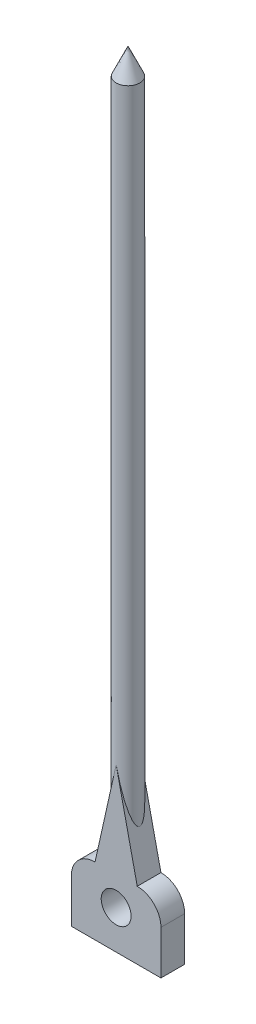
ISO-10303-21;
HEADER;
FILE_DESCRIPTION(('STEP AP214'),'2;1');
FILE_NAME('part.step','',(''),(''),'','','');
FILE_SCHEMA(('AUTOMOTIVE_DESIGN { 1 0 10303 214 1 1 1 1 }'));
ENDSEC;
DATA;
#1=APPLICATION_CONTEXT('core data for automotive mechanical design processes');
#2=APPLICATION_PROTOCOL_DEFINITION('international standard','automotive_design',2000,#1);
#3=PRODUCT_CONTEXT('',#1,'mechanical');
#4=PRODUCT('Part','Part','',(#3));
#5=PRODUCT_RELATED_PRODUCT_CATEGORY('part','',(#4));
#6=PRODUCT_DEFINITION_FORMATION('','',#4);
#7=PRODUCT_DEFINITION_CONTEXT('part definition',#1,'design');
#8=PRODUCT_DEFINITION('design','',#6,#7);
#9=PRODUCT_DEFINITION_SHAPE('','',#8);
#10=(LENGTH_UNIT() NAMED_UNIT(*) SI_UNIT(.MILLI.,.METRE.));
#11=(NAMED_UNIT(*) PLANE_ANGLE_UNIT() SI_UNIT($,.RADIAN.));
#12=(NAMED_UNIT(*) SI_UNIT($,.STERADIAN.) SOLID_ANGLE_UNIT());
#13=UNCERTAINTY_MEASURE_WITH_UNIT(LENGTH_MEASURE(1.E-05),#10,'distance_accuracy_value','');
#14=(GEOMETRIC_REPRESENTATION_CONTEXT(3) GLOBAL_UNCERTAINTY_ASSIGNED_CONTEXT((#13)) GLOBAL_UNIT_ASSIGNED_CONTEXT((#10,
#11,#12)) REPRESENTATION_CONTEXT('',''));
#15=CARTESIAN_POINT('',(0.,0.,0.));
#16=DIRECTION('',(0.,0.,1.));
#17=DIRECTION('',(1.,0.,0.));
#18=AXIS2_PLACEMENT_3D('',#15,#16,#17);
#19=CARTESIAN_POINT('',(9.44828279860412,0.,5.));
#20=DIRECTION('',(-1.,0.,0.));
#21=DIRECTION('',(0.,0.,1.));
#22=AXIS2_PLACEMENT_3D('',#19,#20,#21);
#23=PLANE('',#22);
#24=DIRECTION('',(0.,1.,0.));
#25=VECTOR('',#24,1.);
#26=CARTESIAN_POINT('',(9.44828279860412,0.,0.));
#27=LINE('',#26,#25);
#28=CARTESIAN_POINT('',(9.44828279860412,-8.14999999999999,0.));
#29=VERTEX_POINT('',#28);
#30=CARTESIAN_POINT('',(9.44828279860412,1.10000000000002,0.));
#31=VERTEX_POINT('',#30);
#32=EDGE_CURVE('E135',#29,#31,#27,.T.);
#33=ORIENTED_EDGE('',*,*,#32,.T.);
#34=DIRECTION('',(0.,0.,-1.));
#35=VECTOR('',#34,1.);
#36=CARTESIAN_POINT('',(9.44828279860412,1.10000000000002,5.));
#37=LINE('',#36,#35);
#38=CARTESIAN_POINT('',(9.44828279860412,1.10000000000002,5.));
#39=VERTEX_POINT('',#38);
#40=EDGE_CURVE('E152',#39,#31,#37,.T.);
#41=ORIENTED_EDGE('',*,*,#40,.F.);
#42=DIRECTION('',(0.,1.,0.));
#43=VECTOR('',#42,1.);
#44=CARTESIAN_POINT('',(9.44828279860412,0.,5.));
#45=LINE('',#44,#43);
#46=CARTESIAN_POINT('',(9.44828279860412,-8.14999999999999,5.));
#47=VERTEX_POINT('',#46);
#48=EDGE_CURVE('E176',#47,#39,#45,.T.);
#49=ORIENTED_EDGE('',*,*,#48,.F.);
#50=DIRECTION('',(0.,0.,-1.));
#51=VECTOR('',#50,1.);
#52=CARTESIAN_POINT('',(9.44828279860412,-8.14999999999999,5.));
#53=LINE('',#52,#51);
#54=EDGE_CURVE('E128',#47,#29,#53,.T.);
#55=ORIENTED_EDGE('',*,*,#54,.T.);
#56=EDGE_LOOP('',(#33,#41,#49,#55));
#57=FACE_BOUND('',#56,.T.);
#58=ADVANCED_FACE('F35',(#57),#23,.F.);
#59=CARTESIAN_POINT('',(4.44828279860412,1.10000000000002,5.));
#60=DIRECTION('',(0.,0.,-1.));
#61=DIRECTION('',(-1.,0.,0.));
#62=AXIS2_PLACEMENT_3D('',#59,#60,#61);
#63=CYLINDRICAL_SURFACE('',#62,5.);
#64=CARTESIAN_POINT('',(4.44828279860412,1.10000000000002,0.));
#65=DIRECTION('',(0.,0.,1.));
#66=DIRECTION('',(1.,0.,0.));
#67=AXIS2_PLACEMENT_3D('',#64,#65,#66);
#68=CIRCLE('',#67,5.);
#69=CARTESIAN_POINT('',(4.44828279860412,6.10000000000002,0.));
#70=VERTEX_POINT('',#69);
#71=EDGE_CURVE('E139',#31,#70,#68,.T.);
#72=ORIENTED_EDGE('',*,*,#71,.T.);
#73=DIRECTION('',(0.,0.,-1.));
#74=VECTOR('',#73,1.);
#75=CARTESIAN_POINT('',(4.44828279860412,6.10000000000002,5.));
#76=LINE('',#75,#74);
#77=CARTESIAN_POINT('',(4.44828279860412,6.10000000000002,5.));
#78=VERTEX_POINT('',#77);
#79=EDGE_CURVE('E149',#78,#70,#76,.T.);
#80=ORIENTED_EDGE('',*,*,#79,.F.);
#81=CARTESIAN_POINT('',(4.44828279860412,1.10000000000002,5.));
#82=DIRECTION('',(0.,0.,1.));
#83=DIRECTION('',(1.,0.,0.));
#84=AXIS2_PLACEMENT_3D('',#81,#82,#83);
#85=CIRCLE('',#84,5.);
#86=EDGE_CURVE('E95',#39,#78,#85,.T.);
#87=ORIENTED_EDGE('',*,*,#86,.F.);
#88=ORIENTED_EDGE('',*,*,#40,.T.);
#89=EDGE_LOOP('',(#72,#80,#87,#88));
#90=FACE_BOUND('',#89,.T.);
#91=ADVANCED_FACE('F181',(#90),#63,.T.);
#92=CARTESIAN_POINT('',(-4.44828284917672,1.10000000000002,5.));
#93=DIRECTION('',(0.,0.,-1.));
#94=DIRECTION('',(-1.,0.,0.));
#95=AXIS2_PLACEMENT_3D('',#92,#93,#94);
#96=CYLINDRICAL_SURFACE('',#95,5.);
#97=CARTESIAN_POINT('',(-4.44828284917672,1.10000000000002,0.));
#98=DIRECTION('',(0.,0.,1.));
#99=DIRECTION('',(1.,0.,0.));
#100=AXIS2_PLACEMENT_3D('',#97,#98,#99);
#101=CIRCLE('',#100,5.);
#102=CARTESIAN_POINT('',(-4.44828284917865,6.10000000000002,0.));
#103=VERTEX_POINT('',#102);
#104=CARTESIAN_POINT('',(-9.44828284917672,1.10000000000002,0.));
#105=VERTEX_POINT('',#104);
#106=EDGE_CURVE('E120',#103,#105,#101,.T.);
#107=ORIENTED_EDGE('',*,*,#106,.T.);
#108=DIRECTION('',(0.,0.,-1.));
#109=VECTOR('',#108,1.);
#110=CARTESIAN_POINT('',(-9.44828284917672,1.10000000000002,5.));
#111=LINE('',#110,#109);
#112=CARTESIAN_POINT('',(-9.44828284917672,1.10000000000002,5.));
#113=VERTEX_POINT('',#112);
#114=EDGE_CURVE('E118',#113,#105,#111,.T.);
#115=ORIENTED_EDGE('',*,*,#114,.F.);
#116=CARTESIAN_POINT('',(-4.44828284917672,1.10000000000002,5.));
#117=DIRECTION('',(0.,0.,1.));
#118=DIRECTION('',(1.,0.,0.));
#119=AXIS2_PLACEMENT_3D('',#116,#117,#118);
#120=CIRCLE('',#119,5.);
#121=CARTESIAN_POINT('',(-4.44828284917865,6.10000000000002,5.));
#122=VERTEX_POINT('',#121);
#123=EDGE_CURVE('E104',#122,#113,#120,.T.);
#124=ORIENTED_EDGE('',*,*,#123,.F.);
#125=DIRECTION('',(0.,0.,-1.));
#126=VECTOR('',#125,1.);
#127=CARTESIAN_POINT('',(-4.44828284917865,6.10000000000002,5.));
#128=LINE('',#127,#126);
#129=EDGE_CURVE('E123',#122,#103,#128,.T.);
#130=ORIENTED_EDGE('',*,*,#129,.T.);
#131=EDGE_LOOP('',(#107,#115,#124,#130));
#132=FACE_BOUND('',#131,.T.);
#133=ADVANCED_FACE('F119',(#132),#96,.T.);
#134=CARTESIAN_POINT('',(-9.44828284917673,1.45690293921208E-13,5.));
#135=DIRECTION('',(1.,0.,0.));
#136=DIRECTION('',(0.,1.,0.));
#137=AXIS2_PLACEMENT_3D('',#134,#135,#136);
#138=PLANE('',#137);
#139=DIRECTION('',(0.,-1.,0.));
#140=VECTOR('',#139,1.);
#141=CARTESIAN_POINT('',(-9.44828284917673,1.45690293921208E-13,0.));
#142=LINE('',#141,#140);
#143=CARTESIAN_POINT('',(-9.44828284917686,-8.14999999999999,0.));
#144=VERTEX_POINT('',#143);
#145=EDGE_CURVE('E142',#105,#144,#142,.T.);
#146=ORIENTED_EDGE('',*,*,#145,.T.);
#147=DIRECTION('',(0.,0.,-1.));
#148=VECTOR('',#147,1.);
#149=CARTESIAN_POINT('',(-9.44828284917686,-8.14999999999999,5.));
#150=LINE('',#149,#148);
#151=CARTESIAN_POINT('',(-9.44828284917686,-8.14999999999999,5.));
#152=VERTEX_POINT('',#151);
#153=EDGE_CURVE('E124',#152,#144,#150,.T.);
#154=ORIENTED_EDGE('',*,*,#153,.F.);
#155=DIRECTION('',(0.,-1.,0.));
#156=VECTOR('',#155,1.);
#157=CARTESIAN_POINT('',(-9.44828284917673,1.45690293921208E-13,5.));
#158=LINE('',#157,#156);
#159=EDGE_CURVE('E109',#113,#152,#158,.T.);
#160=ORIENTED_EDGE('',*,*,#159,.F.);
#161=ORIENTED_EDGE('',*,*,#114,.T.);
#162=EDGE_LOOP('',(#146,#154,#160,#161));
#163=FACE_BOUND('',#162,.T.);
#164=ADVANCED_FACE('F126',(#163),#138,.F.);
#165=CARTESIAN_POINT('',(0.,0.,5.));
#166=DIRECTION('',(0.,0.,-1.));
#167=DIRECTION('',(-1.,0.,0.));
#168=AXIS2_PLACEMENT_3D('',#165,#166,#167);
#169=CYLINDRICAL_SURFACE('',#168,3.15);
#170=CARTESIAN_POINT('',(0.,0.,5.));
#171=DIRECTION('',(0.,0.,1.));
#172=DIRECTION('',(1.,0.,0.));
#173=AXIS2_PLACEMENT_3D('',#170,#171,#172);
#174=CIRCLE('',#173,3.15);
#175=CARTESIAN_POINT('',(3.15,0.,5.));
#176=VERTEX_POINT('',#175);
#177=EDGE_CURVE('E145',#176,#176,#174,.T.);
#178=ORIENTED_EDGE('',*,*,#177,.T.);
#179=EDGE_LOOP('',(#178));
#180=FACE_BOUND('',#179,.T.);
#181=CARTESIAN_POINT('',(0.,0.,0.));
#182=DIRECTION('',(0.,0.,1.));
#183=DIRECTION('',(1.,0.,0.));
#184=AXIS2_PLACEMENT_3D('',#181,#182,#183);
#185=CIRCLE('',#184,3.15);
#186=CARTESIAN_POINT('',(3.15,0.,0.));
#187=VERTEX_POINT('',#186);
#188=EDGE_CURVE('E132',#187,#187,#185,.T.);
#189=ORIENTED_EDGE('',*,*,#188,.F.);
#190=EDGE_LOOP('',(#189));
#191=FACE_BOUND('',#190,.T.);
#192=ADVANCED_FACE('F37',(#180,#191),#169,.F.);
#193=CARTESIAN_POINT('',(0.,-8.14999999999999,5.));
#194=DIRECTION('',(0.,1.,0.));
#195=DIRECTION('',(0.,0.,1.));
#196=AXIS2_PLACEMENT_3D('',#193,#194,#195);
#197=PLANE('',#196);
#198=DIRECTION('',(1.,0.,0.));
#199=VECTOR('',#198,1.);
#200=CARTESIAN_POINT('',(0.,-8.14999999999999,0.));
#201=LINE('',#200,#199);
#202=EDGE_CURVE('E86',#144,#29,#201,.T.);
#203=ORIENTED_EDGE('',*,*,#202,.T.);
#204=ORIENTED_EDGE('',*,*,#54,.F.);
#205=DIRECTION('',(1.,0.,0.));
#206=VECTOR('',#205,1.);
#207=CARTESIAN_POINT('',(0.,-8.14999999999999,5.));
#208=LINE('',#207,#206);
#209=EDGE_CURVE('E59',#152,#47,#208,.T.);
#210=ORIENTED_EDGE('',*,*,#209,.F.);
#211=ORIENTED_EDGE('',*,*,#153,.T.);
#212=EDGE_LOOP('',(#203,#204,#210,#211));
#213=FACE_BOUND('',#212,.T.);
#214=ADVANCED_FACE('F189',(#213),#197,.F.);
#215=CARTESIAN_POINT('',(0.,0.,5.));
#216=DIRECTION('',(0.,0.,1.));
#217=DIRECTION('',(1.,0.,0.));
#218=AXIS2_PLACEMENT_3D('',#215,#216,#217);
#219=PLANE('',#218);
#220=DIRECTION('',(0.217351910645245,0.976093308520687,0.));
#221=VECTOR('',#220,1.);
#222=CARTESIAN_POINT('',(0.,26.0765399374634,5.));
#223=LINE('',#222,#221);
#224=CARTESIAN_POINT('',(0.,26.0765399374634,5.));
#225=VERTEX_POINT('',#224);
#226=EDGE_CURVE('E113',#122,#225,#223,.T.);
#227=ORIENTED_EDGE('',*,*,#226,.F.);
#228=ORIENTED_EDGE('',*,*,#123,.T.);
#229=ORIENTED_EDGE('',*,*,#159,.T.);
#230=ORIENTED_EDGE('',*,*,#209,.T.);
#231=ORIENTED_EDGE('',*,*,#48,.T.);
#232=ORIENTED_EDGE('',*,*,#86,.T.);
#233=DIRECTION('',(0.217351908290908,-0.97609330904494,0.));
#234=VECTOR('',#233,1.);
#235=CARTESIAN_POINT('',(0.,26.0765399374634,5.));
#236=LINE('',#235,#234);
#237=EDGE_CURVE('E163',#225,#78,#236,.T.);
#238=ORIENTED_EDGE('',*,*,#237,.F.);
#239=EDGE_LOOP('',(#227,#228,#229,#230,#231,#232,#238));
#240=FACE_BOUND('',#239,.T.);
#241=ORIENTED_EDGE('',*,*,#177,.F.);
#242=EDGE_LOOP('',(#241));
#243=FACE_BOUND('',#242,.T.);
#244=ADVANCED_FACE('F106',(#240,#243),#219,.T.);
#245=CARTESIAN_POINT('',(0.,0.,0.));
#246=DIRECTION('',(0.,0.,1.));
#247=DIRECTION('',(1.,0.,0.));
#248=AXIS2_PLACEMENT_3D('',#245,#246,#247);
#249=PLANE('',#248);
#250=ORIENTED_EDGE('',*,*,#106,.F.);
#251=DIRECTION('',(0.217351910645245,0.976093308520687,0.));
#252=VECTOR('',#251,1.);
#253=CARTESIAN_POINT('',(0.,26.0765399374634,0.));
#254=LINE('',#253,#252);
#255=CARTESIAN_POINT('',(0.,26.0765399374634,0.));
#256=VERTEX_POINT('',#255);
#257=EDGE_CURVE('E50',#103,#256,#254,.T.);
#258=ORIENTED_EDGE('',*,*,#257,.T.);
#259=DIRECTION('',(0.217351908290908,-0.97609330904494,0.));
#260=VECTOR('',#259,1.);
#261=CARTESIAN_POINT('',(0.,26.0765399374634,0.));
#262=LINE('',#261,#260);
#263=EDGE_CURVE('E164',#256,#70,#262,.T.);
#264=ORIENTED_EDGE('',*,*,#263,.T.);
#265=ORIENTED_EDGE('',*,*,#71,.F.);
#266=ORIENTED_EDGE('',*,*,#32,.F.);
#267=ORIENTED_EDGE('',*,*,#202,.F.);
#268=ORIENTED_EDGE('',*,*,#145,.F.);
#269=EDGE_LOOP('',(#250,#258,#264,#265,#266,#267,#268));
#270=FACE_BOUND('',#269,.T.);
#271=ORIENTED_EDGE('',*,*,#188,.T.);
#272=EDGE_LOOP('',(#271));
#273=FACE_BOUND('',#272,.T.);
#274=ADVANCED_FACE('F182',(#270,#273),#249,.F.);
#275=CARTESIAN_POINT('',(0.,26.0765399374634,26.8680366790973));
#276=DIRECTION('',(-0.976093308520687,0.217351910645245,0.));
#277=DIRECTION('',(-0.217351910645245,-0.976093308520687,0.));
#278=AXIS2_PLACEMENT_3D('',#275,#276,#277);
#279=PLANE('',#278);
#280=CARTESIAN_POINT('',(0.,26.0765399374634,2.5));
#281=DIRECTION('',(-0.976093308520687,0.217351910645245,0.));
#282=DIRECTION('',(-0.217351910645245,-0.976093308520687,0.));
#283=AXIS2_PLACEMENT_3D('',#280,#281,#282);
#284=ELLIPSE('',#283,11.5020843045655,2.5);
#285=EDGE_CURVE('E11',#256,#225,#284,.T.);
#286=ORIENTED_EDGE('',*,*,#285,.F.);
#287=ORIENTED_EDGE('',*,*,#257,.F.);
#288=ORIENTED_EDGE('',*,*,#129,.F.);
#289=ORIENTED_EDGE('',*,*,#226,.T.);
#290=EDGE_LOOP('',(#286,#287,#288,#289));
#291=FACE_BOUND('',#290,.T.);
#292=ADVANCED_FACE('F167',(#291),#279,.T.);
#293=CARTESIAN_POINT('',(0.,26.0765399374634,26.8680366790973));
#294=DIRECTION('',(0.97609330904494,0.217351908290908,0.));
#295=DIRECTION('',(-0.217351908290908,0.97609330904494,0.));
#296=AXIS2_PLACEMENT_3D('',#293,#294,#295);
#297=PLANE('',#296);
#298=CARTESIAN_POINT('',(0.,26.0765399374634,2.5));
#299=DIRECTION('',(0.97609330904494,0.217351908290908,0.));
#300=DIRECTION('',(0.217351908290908,-0.97609330904494,0.));
#301=AXIS2_PLACEMENT_3D('',#298,#299,#300);
#302=ELLIPSE('',#301,11.5020844291551,2.5);
#303=EDGE_CURVE('E43',#225,#256,#302,.T.);
#304=ORIENTED_EDGE('',*,*,#303,.F.);
#305=ORIENTED_EDGE('',*,*,#237,.T.);
#306=ORIENTED_EDGE('',*,*,#79,.T.);
#307=ORIENTED_EDGE('',*,*,#263,.F.);
#308=EDGE_LOOP('',(#304,#305,#306,#307));
#309=FACE_BOUND('',#308,.T.);
#310=ADVANCED_FACE('F162',(#309),#297,.T.);
#311=CARTESIAN_POINT('',(0.,156.1,2.5));
#312=DIRECTION('',(0.,-1.,0.));
#313=DIRECTION('',(0.,0.,-1.));
#314=AXIS2_PLACEMENT_3D('',#311,#312,#313);
#315=CONICAL_SURFACE('',#314,0.,0.426823200602846);
#316=CARTESIAN_POINT('',(0.,150.602856099474,2.5));
#317=DIRECTION('',(0.,-1.,0.));
#318=DIRECTION('',(0.,0.,-1.));
#319=AXIS2_PLACEMENT_3D('',#316,#317,#318);
#320=CIRCLE('',#319,2.50000000000001);
#321=CARTESIAN_POINT('',(0.,150.602856099474,0.));
#322=VERTEX_POINT('',#321);
#323=EDGE_CURVE('E136',#322,#322,#320,.T.);
#324=ORIENTED_EDGE('',*,*,#323,.F.);
#325=EDGE_LOOP('',(#324));
#326=FACE_BOUND('',#325,.T.);
#327=CARTESIAN_POINT('',(0.,156.1,2.49999999999999));
#328=VERTEX_POINT('',#327);
#329=VERTEX_LOOP('',#328);
#330=FACE_BOUND('',#329,.T.);
#331=ADVANCED_FACE('F210',(#326,#330),#315,.T.);
#332=CARTESIAN_POINT('',(0.,156.1,2.5));
#333=DIRECTION('',(0.,-1.,0.));
#334=DIRECTION('',(0.,0.,-1.));
#335=AXIS2_PLACEMENT_3D('',#332,#333,#334);
#336=CYLINDRICAL_SURFACE('',#335,2.5);
#337=ORIENTED_EDGE('',*,*,#303,.T.);
#338=ORIENTED_EDGE('',*,*,#285,.T.);
#339=EDGE_LOOP('',(#337,#338));
#340=FACE_BOUND('',#339,.T.);
#341=ORIENTED_EDGE('',*,*,#323,.T.);
#342=EDGE_LOOP('',(#341));
#343=FACE_BOUND('',#342,.T.);
#344=ADVANCED_FACE('F156',(#340,#343),#336,.T.);
#345=CLOSED_SHELL('',(#58,#91,#133,#164,#192,#214,#244,#274,#292,#310,#331,#344));
#346=MANIFOLD_SOLID_BREP('B2',#345);
#347=ADVANCED_BREP_SHAPE_REPRESENTATION('',(#18,#346),#14);
#348=SHAPE_DEFINITION_REPRESENTATION(#9,#347);
ENDSEC;
END-ISO-10303-21;
